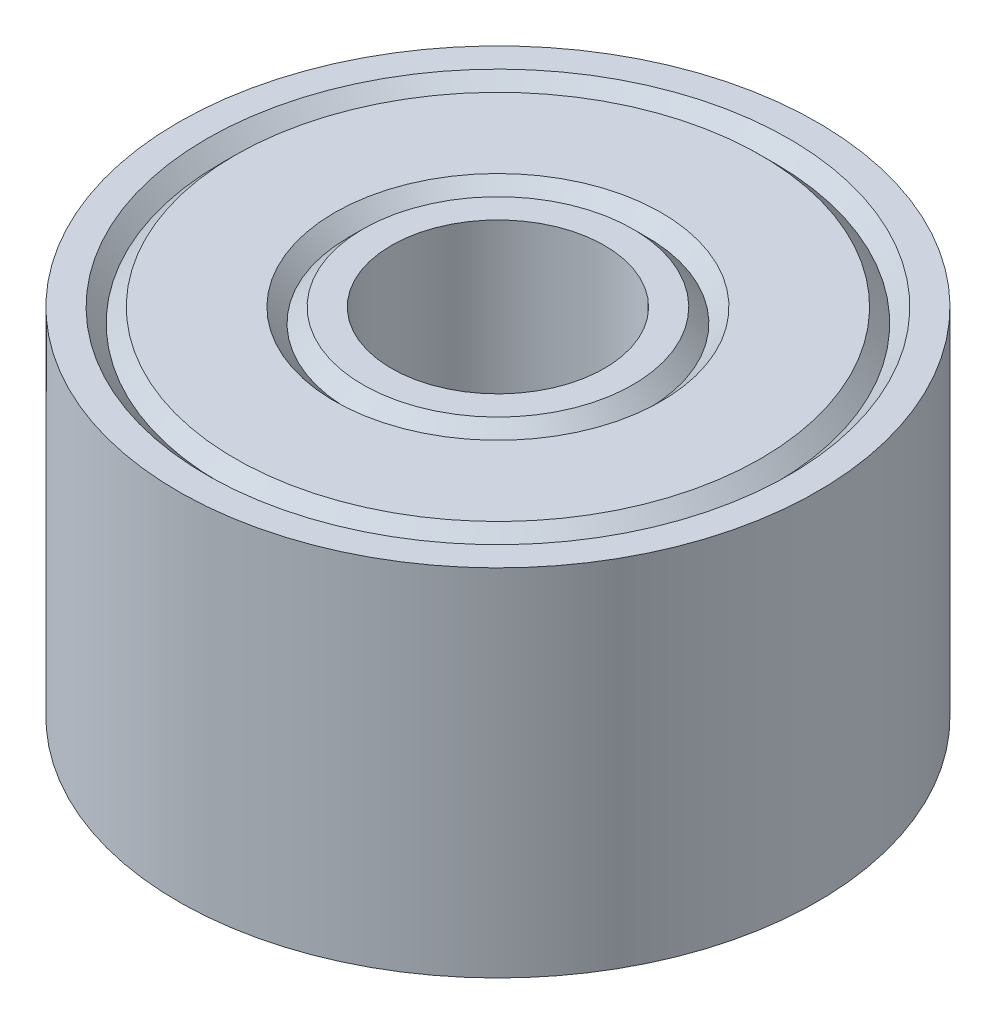
ISO-10303-21;
HEADER;
FILE_DESCRIPTION(('STEP AP214'),'2;1');
FILE_NAME('part.step','',(''),(''),'','','');
FILE_SCHEMA(('AUTOMOTIVE_DESIGN { 1 0 10303 214 1 1 1 1 }'));
ENDSEC;
DATA;
#1=APPLICATION_CONTEXT('core data for automotive mechanical design processes');
#2=APPLICATION_PROTOCOL_DEFINITION('international standard','automotive_design',2000,#1);
#3=PRODUCT_CONTEXT('',#1,'mechanical');
#4=PRODUCT('Part','Part','',(#3));
#5=PRODUCT_RELATED_PRODUCT_CATEGORY('part','',(#4));
#6=PRODUCT_DEFINITION_FORMATION('','',#4);
#7=PRODUCT_DEFINITION_CONTEXT('part definition',#1,'design');
#8=PRODUCT_DEFINITION('design','',#6,#7);
#9=PRODUCT_DEFINITION_SHAPE('','',#8);
#10=(LENGTH_UNIT() NAMED_UNIT(*) SI_UNIT(.MILLI.,.METRE.));
#11=(NAMED_UNIT(*) PLANE_ANGLE_UNIT() SI_UNIT($,.RADIAN.));
#12=(NAMED_UNIT(*) SI_UNIT($,.STERADIAN.) SOLID_ANGLE_UNIT());
#13=UNCERTAINTY_MEASURE_WITH_UNIT(LENGTH_MEASURE(1.E-05),#10,'distance_accuracy_value','');
#14=(GEOMETRIC_REPRESENTATION_CONTEXT(3) GLOBAL_UNCERTAINTY_ASSIGNED_CONTEXT((#13)) GLOBAL_UNIT_ASSIGNED_CONTEXT((#10,
#11,#12)) REPRESENTATION_CONTEXT('',''));
#15=CARTESIAN_POINT('',(0.,0.,0.));
#16=DIRECTION('',(0.,0.,1.));
#17=DIRECTION('',(1.,0.,0.));
#18=AXIS2_PLACEMENT_3D('',#15,#16,#17);
#19=CARTESIAN_POINT('',(0.,2.5,0.));
#20=DIRECTION('',(0.,1.,0.));
#21=DIRECTION('',(-1.,0.,0.));
#22=AXIS2_PLACEMENT_3D('',#19,#20,#21);
#23=CYLINDRICAL_SURFACE('',#22,1.5);
#24=CARTESIAN_POINT('',(0.,2.5,0.));
#25=DIRECTION('',(0.,1.,0.));
#26=DIRECTION('',(-1.,0.,0.));
#27=AXIS2_PLACEMENT_3D('',#24,#25,#26);
#28=CIRCLE('',#27,1.5);
#29=CARTESIAN_POINT('',(-1.5,2.5,0.));
#30=VERTEX_POINT('',#29);
#31=EDGE_CURVE('E83',#30,#30,#28,.T.);
#32=ORIENTED_EDGE('',*,*,#31,.T.);
#33=EDGE_LOOP('',(#32));
#34=FACE_BOUND('',#33,.T.);
#35=CARTESIAN_POINT('',(0.,-2.5,0.));
#36=DIRECTION('',(0.,1.,0.));
#37=DIRECTION('',(-1.,0.,0.));
#38=AXIS2_PLACEMENT_3D('',#35,#36,#37);
#39=CIRCLE('',#38,1.5);
#40=CARTESIAN_POINT('',(-1.5,-2.5,0.));
#41=VERTEX_POINT('',#40);
#42=EDGE_CURVE('E10',#41,#41,#39,.T.);
#43=ORIENTED_EDGE('',*,*,#42,.F.);
#44=EDGE_LOOP('',(#43));
#45=FACE_BOUND('',#44,.T.);
#46=ADVANCED_FACE('F31',(#34,#45),#23,.F.);
#47=CARTESIAN_POINT('',(-1.5,-2.5,0.));
#48=DIRECTION('',(0.,-1.,0.));
#49=DIRECTION('',(1.,0.,0.));
#50=AXIS2_PLACEMENT_3D('',#47,#48,#49);
#51=PLANE('',#50);
#52=ORIENTED_EDGE('',*,*,#42,.T.);
#53=EDGE_LOOP('',(#52));
#54=FACE_BOUND('',#53,.T.);
#55=CARTESIAN_POINT('',(0.,-2.5,0.));
#56=DIRECTION('',(0.,1.,0.));
#57=DIRECTION('',(-1.,0.,0.));
#58=AXIS2_PLACEMENT_3D('',#55,#56,#57);
#59=CIRCLE('',#58,1.9);
#60=CARTESIAN_POINT('',(-1.9,-2.5,0.));
#61=VERTEX_POINT('',#60);
#62=EDGE_CURVE('E37',#61,#61,#59,.T.);
#63=ORIENTED_EDGE('',*,*,#62,.F.);
#64=EDGE_LOOP('',(#63));
#65=FACE_BOUND('',#64,.T.);
#66=ADVANCED_FACE('F101',(#54,#65),#51,.T.);
#67=CARTESIAN_POINT('',(0.,-2.3,0.));
#68=DIRECTION('',(0.,1.,0.));
#69=DIRECTION('',(-1.,0.,0.));
#70=AXIS2_PLACEMENT_3D('',#67,#68,#69);
#71=CONICAL_SURFACE('',#70,2.1,0.785398163397454);
#72=ORIENTED_EDGE('',*,*,#62,.T.);
#73=EDGE_LOOP('',(#72));
#74=FACE_BOUND('',#73,.T.);
#75=CARTESIAN_POINT('',(0.,-2.3,0.));
#76=DIRECTION('',(0.,1.,0.));
#77=DIRECTION('',(-1.,0.,0.));
#78=AXIS2_PLACEMENT_3D('',#75,#76,#77);
#79=CIRCLE('',#78,2.1);
#80=CARTESIAN_POINT('',(-2.1,-2.3,0.));
#81=VERTEX_POINT('',#80);
#82=EDGE_CURVE('E41',#81,#81,#79,.T.);
#83=ORIENTED_EDGE('',*,*,#82,.F.);
#84=EDGE_LOOP('',(#83));
#85=FACE_BOUND('',#84,.T.);
#86=ADVANCED_FACE('F105',(#74,#85),#71,.T.);
#87=CARTESIAN_POINT('',(0.,-2.5,0.));
#88=DIRECTION('',(0.,-1.,0.));
#89=DIRECTION('',(1.,0.,0.));
#90=AXIS2_PLACEMENT_3D('',#87,#88,#89);
#91=CONICAL_SURFACE('',#90,2.3,0.785398163397449);
#92=ORIENTED_EDGE('',*,*,#82,.T.);
#93=EDGE_LOOP('',(#92));
#94=FACE_BOUND('',#93,.T.);
#95=CARTESIAN_POINT('',(0.,-2.5,0.));
#96=DIRECTION('',(0.,1.,0.));
#97=DIRECTION('',(-1.,0.,0.));
#98=AXIS2_PLACEMENT_3D('',#95,#96,#97);
#99=CIRCLE('',#98,2.3);
#100=CARTESIAN_POINT('',(-2.3,-2.5,0.));
#101=VERTEX_POINT('',#100);
#102=EDGE_CURVE('E45',#101,#101,#99,.T.);
#103=ORIENTED_EDGE('',*,*,#102,.F.);
#104=EDGE_LOOP('',(#103));
#105=FACE_BOUND('',#104,.T.);
#106=ADVANCED_FACE('F109',(#94,#105),#91,.F.);
#107=CARTESIAN_POINT('',(-2.3,-2.5,0.));
#108=DIRECTION('',(0.,-1.,0.));
#109=DIRECTION('',(1.,0.,0.));
#110=AXIS2_PLACEMENT_3D('',#107,#108,#109);
#111=PLANE('',#110);
#112=ORIENTED_EDGE('',*,*,#102,.T.);
#113=EDGE_LOOP('',(#112));
#114=FACE_BOUND('',#113,.T.);
#115=CARTESIAN_POINT('',(0.,-2.5,0.));
#116=DIRECTION('',(0.,1.,0.));
#117=DIRECTION('',(-1.,0.,0.));
#118=AXIS2_PLACEMENT_3D('',#115,#116,#117);
#119=CIRCLE('',#118,3.7);
#120=CARTESIAN_POINT('',(-3.7,-2.5,0.));
#121=VERTEX_POINT('',#120);
#122=EDGE_CURVE('E50',#121,#121,#119,.T.);
#123=ORIENTED_EDGE('',*,*,#122,.F.);
#124=EDGE_LOOP('',(#123));
#125=FACE_BOUND('',#124,.T.);
#126=ADVANCED_FACE('F115',(#114,#125),#111,.T.);
#127=CARTESIAN_POINT('',(0.,-2.3,0.));
#128=DIRECTION('',(0.,1.,0.));
#129=DIRECTION('',(-1.,0.,0.));
#130=AXIS2_PLACEMENT_3D('',#127,#128,#129);
#131=CONICAL_SURFACE('',#130,3.9,0.785398163397447);
#132=ORIENTED_EDGE('',*,*,#122,.T.);
#133=EDGE_LOOP('',(#132));
#134=FACE_BOUND('',#133,.T.);
#135=CARTESIAN_POINT('',(0.,-2.3,0.));
#136=DIRECTION('',(0.,1.,0.));
#137=DIRECTION('',(-1.,0.,0.));
#138=AXIS2_PLACEMENT_3D('',#135,#136,#137);
#139=CIRCLE('',#138,3.9);
#140=CARTESIAN_POINT('',(-3.9,-2.3,0.));
#141=VERTEX_POINT('',#140);
#142=EDGE_CURVE('E53',#141,#141,#139,.T.);
#143=ORIENTED_EDGE('',*,*,#142,.F.);
#144=EDGE_LOOP('',(#143));
#145=FACE_BOUND('',#144,.T.);
#146=ADVANCED_FACE('F119',(#134,#145),#131,.T.);
#147=CARTESIAN_POINT('',(0.,-2.5,0.));
#148=DIRECTION('',(0.,-1.,0.));
#149=DIRECTION('',(1.,0.,0.));
#150=AXIS2_PLACEMENT_3D('',#147,#148,#149);
#151=CONICAL_SURFACE('',#150,4.1,0.785398163397445);
#152=ORIENTED_EDGE('',*,*,#142,.T.);
#153=EDGE_LOOP('',(#152));
#154=FACE_BOUND('',#153,.T.);
#155=CARTESIAN_POINT('',(0.,-2.5,0.));
#156=DIRECTION('',(0.,1.,0.));
#157=DIRECTION('',(-1.,0.,0.));
#158=AXIS2_PLACEMENT_3D('',#155,#156,#157);
#159=CIRCLE('',#158,4.1);
#160=CARTESIAN_POINT('',(-4.1,-2.5,0.));
#161=VERTEX_POINT('',#160);
#162=EDGE_CURVE('E56',#161,#161,#159,.T.);
#163=ORIENTED_EDGE('',*,*,#162,.F.);
#164=EDGE_LOOP('',(#163));
#165=FACE_BOUND('',#164,.T.);
#166=ADVANCED_FACE('F123',(#154,#165),#151,.F.);
#167=CARTESIAN_POINT('',(-4.1,-2.5,0.));
#168=DIRECTION('',(0.,-1.,0.));
#169=DIRECTION('',(1.,0.,0.));
#170=AXIS2_PLACEMENT_3D('',#167,#168,#169);
#171=PLANE('',#170);
#172=ORIENTED_EDGE('',*,*,#162,.T.);
#173=EDGE_LOOP('',(#172));
#174=FACE_BOUND('',#173,.T.);
#175=CARTESIAN_POINT('',(0.,-2.5,0.));
#176=DIRECTION('',(0.,1.,0.));
#177=DIRECTION('',(-1.,0.,0.));
#178=AXIS2_PLACEMENT_3D('',#175,#176,#177);
#179=CIRCLE('',#178,4.5);
#180=CARTESIAN_POINT('',(-4.5,-2.5,0.));
#181=VERTEX_POINT('',#180);
#182=EDGE_CURVE('E59',#181,#181,#179,.T.);
#183=ORIENTED_EDGE('',*,*,#182,.F.);
#184=EDGE_LOOP('',(#183));
#185=FACE_BOUND('',#184,.T.);
#186=ADVANCED_FACE('F127',(#174,#185),#171,.T.);
#187=CARTESIAN_POINT('',(0.,2.5,0.));
#188=DIRECTION('',(0.,1.,0.));
#189=DIRECTION('',(-1.,0.,0.));
#190=AXIS2_PLACEMENT_3D('',#187,#188,#189);
#191=CYLINDRICAL_SURFACE('',#190,4.5);
#192=ORIENTED_EDGE('',*,*,#182,.T.);
#193=EDGE_LOOP('',(#192));
#194=FACE_BOUND('',#193,.T.);
#195=CARTESIAN_POINT('',(0.,2.5,0.));
#196=DIRECTION('',(0.,1.,0.));
#197=DIRECTION('',(-1.,0.,0.));
#198=AXIS2_PLACEMENT_3D('',#195,#196,#197);
#199=CIRCLE('',#198,4.5);
#200=CARTESIAN_POINT('',(-4.5,2.5,0.));
#201=VERTEX_POINT('',#200);
#202=EDGE_CURVE('E62',#201,#201,#199,.T.);
#203=ORIENTED_EDGE('',*,*,#202,.F.);
#204=EDGE_LOOP('',(#203));
#205=FACE_BOUND('',#204,.T.);
#206=ADVANCED_FACE('F131',(#194,#205),#191,.T.);
#207=CARTESIAN_POINT('',(-4.1,2.5,0.));
#208=DIRECTION('',(0.,1.,0.));
#209=DIRECTION('',(-1.,0.,0.));
#210=AXIS2_PLACEMENT_3D('',#207,#208,#209);
#211=PLANE('',#210);
#212=ORIENTED_EDGE('',*,*,#202,.T.);
#213=EDGE_LOOP('',(#212));
#214=FACE_BOUND('',#213,.T.);
#215=CARTESIAN_POINT('',(0.,2.5,0.));
#216=DIRECTION('',(0.,1.,0.));
#217=DIRECTION('',(-1.,0.,0.));
#218=AXIS2_PLACEMENT_3D('',#215,#216,#217);
#219=CIRCLE('',#218,4.1);
#220=CARTESIAN_POINT('',(-4.1,2.5,0.));
#221=VERTEX_POINT('',#220);
#222=EDGE_CURVE('E65',#221,#221,#219,.T.);
#223=ORIENTED_EDGE('',*,*,#222,.F.);
#224=EDGE_LOOP('',(#223));
#225=FACE_BOUND('',#224,.T.);
#226=ADVANCED_FACE('F135',(#214,#225),#211,.T.);
#227=CARTESIAN_POINT('',(0.,2.3,0.));
#228=DIRECTION('',(0.,1.,0.));
#229=DIRECTION('',(-1.,0.,0.));
#230=AXIS2_PLACEMENT_3D('',#227,#228,#229);
#231=CONICAL_SURFACE('',#230,3.9,0.785398163397444);
#232=ORIENTED_EDGE('',*,*,#222,.T.);
#233=EDGE_LOOP('',(#232));
#234=FACE_BOUND('',#233,.T.);
#235=CARTESIAN_POINT('',(0.,2.3,0.));
#236=DIRECTION('',(0.,1.,0.));
#237=DIRECTION('',(-1.,0.,0.));
#238=AXIS2_PLACEMENT_3D('',#235,#236,#237);
#239=CIRCLE('',#238,3.9);
#240=CARTESIAN_POINT('',(-3.9,2.3,0.));
#241=VERTEX_POINT('',#240);
#242=EDGE_CURVE('E68',#241,#241,#239,.T.);
#243=ORIENTED_EDGE('',*,*,#242,.F.);
#244=EDGE_LOOP('',(#243));
#245=FACE_BOUND('',#244,.T.);
#246=ADVANCED_FACE('F139',(#234,#245),#231,.F.);
#247=CARTESIAN_POINT('',(0.,2.5,0.));
#248=DIRECTION('',(0.,-1.,0.));
#249=DIRECTION('',(1.,0.,0.));
#250=AXIS2_PLACEMENT_3D('',#247,#248,#249);
#251=CONICAL_SURFACE('',#250,3.7,0.78539816339745);
#252=ORIENTED_EDGE('',*,*,#242,.T.);
#253=EDGE_LOOP('',(#252));
#254=FACE_BOUND('',#253,.T.);
#255=CARTESIAN_POINT('',(0.,2.5,0.));
#256=DIRECTION('',(0.,1.,0.));
#257=DIRECTION('',(-1.,0.,0.));
#258=AXIS2_PLACEMENT_3D('',#255,#256,#257);
#259=CIRCLE('',#258,3.7);
#260=CARTESIAN_POINT('',(-3.7,2.5,0.));
#261=VERTEX_POINT('',#260);
#262=EDGE_CURVE('E71',#261,#261,#259,.T.);
#263=ORIENTED_EDGE('',*,*,#262,.F.);
#264=EDGE_LOOP('',(#263));
#265=FACE_BOUND('',#264,.T.);
#266=ADVANCED_FACE('F143',(#254,#265),#251,.T.);
#267=CARTESIAN_POINT('',(-2.3,2.5,0.));
#268=DIRECTION('',(0.,1.,0.));
#269=DIRECTION('',(-1.,0.,0.));
#270=AXIS2_PLACEMENT_3D('',#267,#268,#269);
#271=PLANE('',#270);
#272=ORIENTED_EDGE('',*,*,#262,.T.);
#273=EDGE_LOOP('',(#272));
#274=FACE_BOUND('',#273,.T.);
#275=CARTESIAN_POINT('',(0.,2.5,0.));
#276=DIRECTION('',(0.,1.,0.));
#277=DIRECTION('',(-1.,0.,0.));
#278=AXIS2_PLACEMENT_3D('',#275,#276,#277);
#279=CIRCLE('',#278,2.3);
#280=CARTESIAN_POINT('',(-2.3,2.5,0.));
#281=VERTEX_POINT('',#280);
#282=EDGE_CURVE('E74',#281,#281,#279,.T.);
#283=ORIENTED_EDGE('',*,*,#282,.F.);
#284=EDGE_LOOP('',(#283));
#285=FACE_BOUND('',#284,.T.);
#286=ADVANCED_FACE('F147',(#274,#285),#271,.T.);
#287=CARTESIAN_POINT('',(0.,2.3,0.));
#288=DIRECTION('',(0.,1.,0.));
#289=DIRECTION('',(-1.,0.,0.));
#290=AXIS2_PLACEMENT_3D('',#287,#288,#289);
#291=CONICAL_SURFACE('',#290,2.1,0.785398163397449);
#292=ORIENTED_EDGE('',*,*,#282,.T.);
#293=EDGE_LOOP('',(#292));
#294=FACE_BOUND('',#293,.T.);
#295=CARTESIAN_POINT('',(0.,2.3,0.));
#296=DIRECTION('',(0.,1.,0.));
#297=DIRECTION('',(-1.,0.,0.));
#298=AXIS2_PLACEMENT_3D('',#295,#296,#297);
#299=CIRCLE('',#298,2.1);
#300=CARTESIAN_POINT('',(-2.1,2.3,0.));
#301=VERTEX_POINT('',#300);
#302=EDGE_CURVE('E77',#301,#301,#299,.T.);
#303=ORIENTED_EDGE('',*,*,#302,.F.);
#304=EDGE_LOOP('',(#303));
#305=FACE_BOUND('',#304,.T.);
#306=ADVANCED_FACE('F97',(#294,#305),#291,.F.);
#307=CARTESIAN_POINT('',(0.,2.5,0.));
#308=DIRECTION('',(0.,-1.,0.));
#309=DIRECTION('',(1.,0.,0.));
#310=AXIS2_PLACEMENT_3D('',#307,#308,#309);
#311=CONICAL_SURFACE('',#310,1.9,0.78539816339745);
#312=ORIENTED_EDGE('',*,*,#302,.T.);
#313=EDGE_LOOP('',(#312));
#314=FACE_BOUND('',#313,.T.);
#315=CARTESIAN_POINT('',(0.,2.5,0.));
#316=DIRECTION('',(0.,1.,0.));
#317=DIRECTION('',(-1.,0.,0.));
#318=AXIS2_PLACEMENT_3D('',#315,#316,#317);
#319=CIRCLE('',#318,1.9);
#320=CARTESIAN_POINT('',(-1.9,2.5,0.));
#321=VERTEX_POINT('',#320);
#322=EDGE_CURVE('E80',#321,#321,#319,.T.);
#323=ORIENTED_EDGE('',*,*,#322,.F.);
#324=EDGE_LOOP('',(#323));
#325=FACE_BOUND('',#324,.T.);
#326=ADVANCED_FACE('F91',(#314,#325),#311,.T.);
#327=CARTESIAN_POINT('',(-1.5,2.5,0.));
#328=DIRECTION('',(0.,1.,0.));
#329=DIRECTION('',(-1.,0.,0.));
#330=AXIS2_PLACEMENT_3D('',#327,#328,#329);
#331=PLANE('',#330);
#332=ORIENTED_EDGE('',*,*,#322,.T.);
#333=EDGE_LOOP('',(#332));
#334=FACE_BOUND('',#333,.T.);
#335=ORIENTED_EDGE('',*,*,#31,.F.);
#336=EDGE_LOOP('',(#335));
#337=FACE_BOUND('',#336,.T.);
#338=ADVANCED_FACE('F89',(#334,#337),#331,.T.);
#339=CLOSED_SHELL('',(#46,#66,#86,#106,#126,#146,#166,#186,#206,#226,#246,#266,#286,#306,#326,#338));
#340=MANIFOLD_SOLID_BREP('B2',#339);
#341=ADVANCED_BREP_SHAPE_REPRESENTATION('',(#18,#340),#14);
#342=SHAPE_DEFINITION_REPRESENTATION(#9,#341);
ENDSEC;
END-ISO-10303-21;
